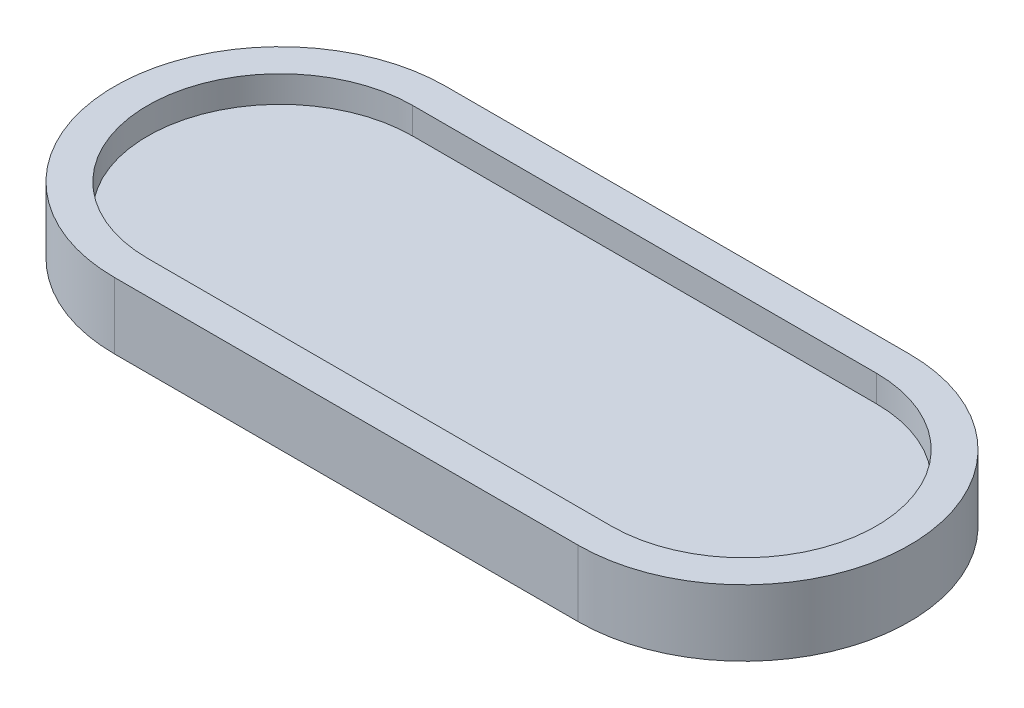
ISO-10303-21;
HEADER;
FILE_DESCRIPTION(('STEP AP214'),'2;1');
FILE_NAME('part.step','',(''),(''),'','','');
FILE_SCHEMA(('AUTOMOTIVE_DESIGN { 1 0 10303 214 1 1 1 1 }'));
ENDSEC;
DATA;
#1=APPLICATION_CONTEXT('core data for automotive mechanical design processes');
#2=APPLICATION_PROTOCOL_DEFINITION('international standard','automotive_design',2000,#1);
#3=PRODUCT_CONTEXT('',#1,'mechanical');
#4=PRODUCT('Part','Part','',(#3));
#5=PRODUCT_RELATED_PRODUCT_CATEGORY('part','',(#4));
#6=PRODUCT_DEFINITION_FORMATION('','',#4);
#7=PRODUCT_DEFINITION_CONTEXT('part definition',#1,'design');
#8=PRODUCT_DEFINITION('design','',#6,#7);
#9=PRODUCT_DEFINITION_SHAPE('','',#8);
#10=(LENGTH_UNIT() NAMED_UNIT(*) SI_UNIT(.MILLI.,.METRE.));
#11=(NAMED_UNIT(*) PLANE_ANGLE_UNIT() SI_UNIT($,.RADIAN.));
#12=(NAMED_UNIT(*) SI_UNIT($,.STERADIAN.) SOLID_ANGLE_UNIT());
#13=UNCERTAINTY_MEASURE_WITH_UNIT(LENGTH_MEASURE(1.E-05),#10,'distance_accuracy_value','');
#14=(GEOMETRIC_REPRESENTATION_CONTEXT(3) GLOBAL_UNCERTAINTY_ASSIGNED_CONTEXT((#13)) GLOBAL_UNIT_ASSIGNED_CONTEXT((#10,
#11,#12)) REPRESENTATION_CONTEXT('',''));
#15=CARTESIAN_POINT('',(0.,0.,0.));
#16=DIRECTION('',(0.,0.,1.));
#17=DIRECTION('',(1.,0.,0.));
#18=AXIS2_PLACEMENT_3D('',#15,#16,#17);
#19=CARTESIAN_POINT('',(0.,5.,0.));
#20=DIRECTION('',(0.,-1.,0.));
#21=DIRECTION('',(0.,0.,-1.));
#22=AXIS2_PLACEMENT_3D('',#19,#20,#21);
#23=CYLINDRICAL_SURFACE('',#22,12.5);
#24=CARTESIAN_POINT('',(0.,0.,0.));
#25=DIRECTION('',(0.,1.,0.));
#26=DIRECTION('',(0.,0.,1.));
#27=AXIS2_PLACEMENT_3D('',#24,#25,#26);
#28=CIRCLE('',#27,12.5);
#29=CARTESIAN_POINT('',(0.,0.,-12.5));
#30=VERTEX_POINT('',#29);
#31=CARTESIAN_POINT('',(0.,0.,12.5));
#32=VERTEX_POINT('',#31);
#33=EDGE_CURVE('E141',#30,#32,#28,.T.);
#34=ORIENTED_EDGE('',*,*,#33,.T.);
#35=DIRECTION('',(0.,-1.,0.));
#36=VECTOR('',#35,1.);
#37=CARTESIAN_POINT('',(0.,5.,12.5));
#38=LINE('',#37,#36);
#39=CARTESIAN_POINT('',(0.,5.,12.5));
#40=VERTEX_POINT('',#39);
#41=EDGE_CURVE('E11',#40,#32,#38,.T.);
#42=ORIENTED_EDGE('',*,*,#41,.F.);
#43=CARTESIAN_POINT('',(0.,5.,0.));
#44=DIRECTION('',(0.,1.,0.));
#45=DIRECTION('',(0.,0.,1.));
#46=AXIS2_PLACEMENT_3D('',#43,#44,#45);
#47=CIRCLE('',#46,12.5);
#48=CARTESIAN_POINT('',(0.,5.,-12.5));
#49=VERTEX_POINT('',#48);
#50=EDGE_CURVE('E145',#49,#40,#47,.T.);
#51=ORIENTED_EDGE('',*,*,#50,.F.);
#52=DIRECTION('',(0.,-1.,0.));
#53=VECTOR('',#52,1.);
#54=CARTESIAN_POINT('',(0.,5.,-12.5));
#55=LINE('',#54,#53);
#56=EDGE_CURVE('E151',#49,#30,#55,.T.);
#57=ORIENTED_EDGE('',*,*,#56,.T.);
#58=EDGE_LOOP('',(#34,#42,#51,#57));
#59=FACE_BOUND('',#58,.T.);
#60=ADVANCED_FACE('F33',(#59),#23,.T.);
#61=CARTESIAN_POINT('',(0.,5.,12.5));
#62=DIRECTION('',(0.,0.,-1.));
#63=DIRECTION('',(-1.,0.,0.));
#64=AXIS2_PLACEMENT_3D('',#61,#62,#63);
#65=PLANE('',#64);
#66=DIRECTION('',(1.,0.,0.));
#67=VECTOR('',#66,1.);
#68=CARTESIAN_POINT('',(0.,0.,12.5));
#69=LINE('',#68,#67);
#70=CARTESIAN_POINT('',(35.,0.,12.5));
#71=VERTEX_POINT('',#70);
#72=EDGE_CURVE('E154',#32,#71,#69,.T.);
#73=ORIENTED_EDGE('',*,*,#72,.T.);
#74=DIRECTION('',(0.,-1.,0.));
#75=VECTOR('',#74,1.);
#76=CARTESIAN_POINT('',(35.,5.,12.5));
#77=LINE('',#76,#75);
#78=CARTESIAN_POINT('',(35.,5.,12.5));
#79=VERTEX_POINT('',#78);
#80=EDGE_CURVE('E40',#79,#71,#77,.T.);
#81=ORIENTED_EDGE('',*,*,#80,.F.);
#82=DIRECTION('',(1.,0.,0.));
#83=VECTOR('',#82,1.);
#84=CARTESIAN_POINT('',(0.,5.,12.5));
#85=LINE('',#84,#83);
#86=EDGE_CURVE('E84',#40,#79,#85,.T.);
#87=ORIENTED_EDGE('',*,*,#86,.F.);
#88=ORIENTED_EDGE('',*,*,#41,.T.);
#89=EDGE_LOOP('',(#73,#81,#87,#88));
#90=FACE_BOUND('',#89,.T.);
#91=ADVANCED_FACE('F183',(#90),#65,.F.);
#92=CARTESIAN_POINT('',(35.,5.,0.));
#93=DIRECTION('',(0.,-1.,0.));
#94=DIRECTION('',(0.,0.,-1.));
#95=AXIS2_PLACEMENT_3D('',#92,#93,#94);
#96=CYLINDRICAL_SURFACE('',#95,12.5);
#97=CARTESIAN_POINT('',(35.,0.,0.));
#98=DIRECTION('',(0.,1.,0.));
#99=DIRECTION('',(0.,0.,1.));
#100=AXIS2_PLACEMENT_3D('',#97,#98,#99);
#101=CIRCLE('',#100,12.5);
#102=CARTESIAN_POINT('',(35.,0.,-12.5));
#103=VERTEX_POINT('',#102);
#104=EDGE_CURVE('E156',#71,#103,#101,.T.);
#105=ORIENTED_EDGE('',*,*,#104,.T.);
#106=DIRECTION('',(0.,-1.,0.));
#107=VECTOR('',#106,1.);
#108=CARTESIAN_POINT('',(35.,5.,-12.5));
#109=LINE('',#108,#107);
#110=CARTESIAN_POINT('',(35.,5.,-12.5));
#111=VERTEX_POINT('',#110);
#112=EDGE_CURVE('E160',#111,#103,#109,.T.);
#113=ORIENTED_EDGE('',*,*,#112,.F.);
#114=CARTESIAN_POINT('',(35.,5.,0.));
#115=DIRECTION('',(0.,1.,0.));
#116=DIRECTION('',(0.,0.,1.));
#117=AXIS2_PLACEMENT_3D('',#114,#115,#116);
#118=CIRCLE('',#117,12.5);
#119=EDGE_CURVE('E148',#79,#111,#118,.T.);
#120=ORIENTED_EDGE('',*,*,#119,.F.);
#121=ORIENTED_EDGE('',*,*,#80,.T.);
#122=EDGE_LOOP('',(#105,#113,#120,#121));
#123=FACE_BOUND('',#122,.T.);
#124=ADVANCED_FACE('F165',(#123),#96,.T.);
#125=CARTESIAN_POINT('',(0.,5.,-12.5));
#126=DIRECTION('',(0.,0.,1.));
#127=DIRECTION('',(1.,0.,0.));
#128=AXIS2_PLACEMENT_3D('',#125,#126,#127);
#129=PLANE('',#128);
#130=DIRECTION('',(-1.,0.,0.));
#131=VECTOR('',#130,1.);
#132=CARTESIAN_POINT('',(0.,0.,-12.5));
#133=LINE('',#132,#131);
#134=EDGE_CURVE('E77',#103,#30,#133,.T.);
#135=ORIENTED_EDGE('',*,*,#134,.T.);
#136=ORIENTED_EDGE('',*,*,#56,.F.);
#137=DIRECTION('',(-1.,0.,0.));
#138=VECTOR('',#137,1.);
#139=CARTESIAN_POINT('',(0.,5.,-12.5));
#140=LINE('',#139,#138);
#141=EDGE_CURVE('E56',#111,#49,#140,.T.);
#142=ORIENTED_EDGE('',*,*,#141,.F.);
#143=ORIENTED_EDGE('',*,*,#112,.T.);
#144=EDGE_LOOP('',(#135,#136,#142,#143));
#145=FACE_BOUND('',#144,.T.);
#146=ADVANCED_FACE('F173',(#145),#129,.F.);
#147=CARTESIAN_POINT('',(0.,5.,0.));
#148=DIRECTION('',(0.,1.,0.));
#149=DIRECTION('',(0.,0.,1.));
#150=AXIS2_PLACEMENT_3D('',#147,#148,#149);
#151=PLANE('',#150);
#152=CARTESIAN_POINT('',(0.,5.,0.));
#153=DIRECTION('',(0.,1.,0.));
#154=DIRECTION('',(0.,0.,1.));
#155=AXIS2_PLACEMENT_3D('',#152,#153,#154);
#156=CIRCLE('',#155,10.);
#157=CARTESIAN_POINT('',(0.,5.,-10.));
#158=VERTEX_POINT('',#157);
#159=CARTESIAN_POINT('',(0.,5.,10.));
#160=VERTEX_POINT('',#159);
#161=EDGE_CURVE('E47',#158,#160,#156,.T.);
#162=ORIENTED_EDGE('',*,*,#161,.F.);
#163=DIRECTION('',(-1.,0.,0.));
#164=VECTOR('',#163,1.);
#165=CARTESIAN_POINT('',(35.,5.,-10.));
#166=LINE('',#165,#164);
#167=CARTESIAN_POINT('',(35.,5.,-10.));
#168=VERTEX_POINT('',#167);
#169=EDGE_CURVE('E126',#168,#158,#166,.T.);
#170=ORIENTED_EDGE('',*,*,#169,.F.);
#171=CARTESIAN_POINT('',(35.,5.,0.));
#172=DIRECTION('',(0.,1.,0.));
#173=DIRECTION('',(0.,0.,1.));
#174=AXIS2_PLACEMENT_3D('',#171,#172,#173);
#175=CIRCLE('',#174,10.);
#176=CARTESIAN_POINT('',(35.,5.,10.));
#177=VERTEX_POINT('',#176);
#178=EDGE_CURVE('E129',#177,#168,#175,.T.);
#179=ORIENTED_EDGE('',*,*,#178,.F.);
#180=DIRECTION('',(1.,0.,0.));
#181=VECTOR('',#180,1.);
#182=CARTESIAN_POINT('',(0.,5.,10.));
#183=LINE('',#182,#181);
#184=EDGE_CURVE('E135',#160,#177,#183,.T.);
#185=ORIENTED_EDGE('',*,*,#184,.F.);
#186=EDGE_LOOP('',(#162,#170,#179,#185));
#187=FACE_BOUND('',#186,.T.);
#188=ORIENTED_EDGE('',*,*,#50,.T.);
#189=ORIENTED_EDGE('',*,*,#86,.T.);
#190=ORIENTED_EDGE('',*,*,#119,.T.);
#191=ORIENTED_EDGE('',*,*,#141,.T.);
#192=EDGE_LOOP('',(#188,#189,#190,#191));
#193=FACE_BOUND('',#192,.T.);
#194=ADVANCED_FACE('F175',(#187,#193),#151,.T.);
#195=CARTESIAN_POINT('',(0.,0.,0.));
#196=DIRECTION('',(0.,1.,0.));
#197=DIRECTION('',(0.,0.,1.));
#198=AXIS2_PLACEMENT_3D('',#195,#196,#197);
#199=PLANE('',#198);
#200=ORIENTED_EDGE('',*,*,#33,.F.);
#201=ORIENTED_EDGE('',*,*,#134,.F.);
#202=ORIENTED_EDGE('',*,*,#104,.F.);
#203=ORIENTED_EDGE('',*,*,#72,.F.);
#204=EDGE_LOOP('',(#200,#201,#202,#203));
#205=FACE_BOUND('',#204,.T.);
#206=ADVANCED_FACE('F169',(#205),#199,.F.);
#207=CARTESIAN_POINT('',(0.,3.,0.));
#208=DIRECTION('',(0.,1.,0.));
#209=DIRECTION('',(0.,0.,1.));
#210=AXIS2_PLACEMENT_3D('',#207,#208,#209);
#211=CYLINDRICAL_SURFACE('',#210,10.);
#212=ORIENTED_EDGE('',*,*,#161,.T.);
#213=DIRECTION('',(0.,1.,0.));
#214=VECTOR('',#213,1.);
#215=CARTESIAN_POINT('',(0.,3.,10.));
#216=LINE('',#215,#214);
#217=CARTESIAN_POINT('',(0.,3.,10.));
#218=VERTEX_POINT('',#217);
#219=EDGE_CURVE('E104',#218,#160,#216,.T.);
#220=ORIENTED_EDGE('',*,*,#219,.F.);
#221=CARTESIAN_POINT('',(0.,3.,0.));
#222=DIRECTION('',(0.,1.,0.));
#223=DIRECTION('',(0.,0.,1.));
#224=AXIS2_PLACEMENT_3D('',#221,#222,#223);
#225=CIRCLE('',#224,10.);
#226=CARTESIAN_POINT('',(0.,3.,-10.));
#227=VERTEX_POINT('',#226);
#228=EDGE_CURVE('E108',#227,#218,#225,.T.);
#229=ORIENTED_EDGE('',*,*,#228,.F.);
#230=DIRECTION('',(0.,1.,0.));
#231=VECTOR('',#230,1.);
#232=CARTESIAN_POINT('',(0.,3.,-10.));
#233=LINE('',#232,#231);
#234=EDGE_CURVE('E139',#227,#158,#233,.T.);
#235=ORIENTED_EDGE('',*,*,#234,.T.);
#236=EDGE_LOOP('',(#212,#220,#229,#235));
#237=FACE_BOUND('',#236,.T.);
#238=ADVANCED_FACE('F106',(#237),#211,.F.);
#239=CARTESIAN_POINT('',(35.,3.,-10.));
#240=DIRECTION('',(0.,0.,-1.));
#241=DIRECTION('',(-1.,0.,0.));
#242=AXIS2_PLACEMENT_3D('',#239,#240,#241);
#243=PLANE('',#242);
#244=ORIENTED_EDGE('',*,*,#169,.T.);
#245=ORIENTED_EDGE('',*,*,#234,.F.);
#246=DIRECTION('',(-1.,0.,0.));
#247=VECTOR('',#246,1.);
#248=CARTESIAN_POINT('',(35.,3.,-10.));
#249=LINE('',#248,#247);
#250=CARTESIAN_POINT('',(35.,3.,-10.));
#251=VERTEX_POINT('',#250);
#252=EDGE_CURVE('E114',#251,#227,#249,.T.);
#253=ORIENTED_EDGE('',*,*,#252,.F.);
#254=DIRECTION('',(0.,1.,0.));
#255=VECTOR('',#254,1.);
#256=CARTESIAN_POINT('',(35.,3.,-10.));
#257=LINE('',#256,#255);
#258=EDGE_CURVE('E142',#251,#168,#257,.T.);
#259=ORIENTED_EDGE('',*,*,#258,.T.);
#260=EDGE_LOOP('',(#244,#245,#253,#259));
#261=FACE_BOUND('',#260,.T.);
#262=ADVANCED_FACE('F222',(#261),#243,.F.);
#263=CARTESIAN_POINT('',(35.,3.,0.));
#264=DIRECTION('',(0.,1.,0.));
#265=DIRECTION('',(0.,0.,1.));
#266=AXIS2_PLACEMENT_3D('',#263,#264,#265);
#267=CYLINDRICAL_SURFACE('',#266,10.);
#268=ORIENTED_EDGE('',*,*,#178,.T.);
#269=ORIENTED_EDGE('',*,*,#258,.F.);
#270=CARTESIAN_POINT('',(35.,3.,0.));
#271=DIRECTION('',(0.,1.,0.));
#272=DIRECTION('',(0.,0.,1.));
#273=AXIS2_PLACEMENT_3D('',#270,#271,#272);
#274=CIRCLE('',#273,10.);
#275=CARTESIAN_POINT('',(35.,3.,10.));
#276=VERTEX_POINT('',#275);
#277=EDGE_CURVE('E122',#276,#251,#274,.T.);
#278=ORIENTED_EDGE('',*,*,#277,.F.);
#279=DIRECTION('',(0.,1.,0.));
#280=VECTOR('',#279,1.);
#281=CARTESIAN_POINT('',(35.,3.,10.));
#282=LINE('',#281,#280);
#283=EDGE_CURVE('E113',#276,#177,#282,.T.);
#284=ORIENTED_EDGE('',*,*,#283,.T.);
#285=EDGE_LOOP('',(#268,#269,#278,#284));
#286=FACE_BOUND('',#285,.T.);
#287=ADVANCED_FACE('F231',(#286),#267,.F.);
#288=CARTESIAN_POINT('',(0.,3.,10.));
#289=DIRECTION('',(0.,0.,1.));
#290=DIRECTION('',(1.,0.,0.));
#291=AXIS2_PLACEMENT_3D('',#288,#289,#290);
#292=PLANE('',#291);
#293=ORIENTED_EDGE('',*,*,#184,.T.);
#294=ORIENTED_EDGE('',*,*,#283,.F.);
#295=DIRECTION('',(1.,0.,0.));
#296=VECTOR('',#295,1.);
#297=CARTESIAN_POINT('',(0.,3.,10.));
#298=LINE('',#297,#296);
#299=EDGE_CURVE('E117',#218,#276,#298,.T.);
#300=ORIENTED_EDGE('',*,*,#299,.F.);
#301=ORIENTED_EDGE('',*,*,#219,.T.);
#302=EDGE_LOOP('',(#293,#294,#300,#301));
#303=FACE_BOUND('',#302,.T.);
#304=ADVANCED_FACE('F118',(#303),#292,.F.);
#305=CARTESIAN_POINT('',(0.,3.,0.));
#306=DIRECTION('',(0.,1.,0.));
#307=DIRECTION('',(0.,0.,1.));
#308=AXIS2_PLACEMENT_3D('',#305,#306,#307);
#309=PLANE('',#308);
#310=ORIENTED_EDGE('',*,*,#228,.T.);
#311=ORIENTED_EDGE('',*,*,#299,.T.);
#312=ORIENTED_EDGE('',*,*,#277,.T.);
#313=ORIENTED_EDGE('',*,*,#252,.T.);
#314=EDGE_LOOP('',(#310,#311,#312,#313));
#315=FACE_BOUND('',#314,.T.);
#316=ADVANCED_FACE('F124',(#315),#309,.T.);
#317=CLOSED_SHELL('',(#60,#91,#124,#146,#194,#206,#238,#262,#287,#304,#316));
#318=MANIFOLD_SOLID_BREP('B2',#317);
#319=ADVANCED_BREP_SHAPE_REPRESENTATION('',(#18,#318),#14);
#320=SHAPE_DEFINITION_REPRESENTATION(#9,#319);
ENDSEC;
END-ISO-10303-21;
